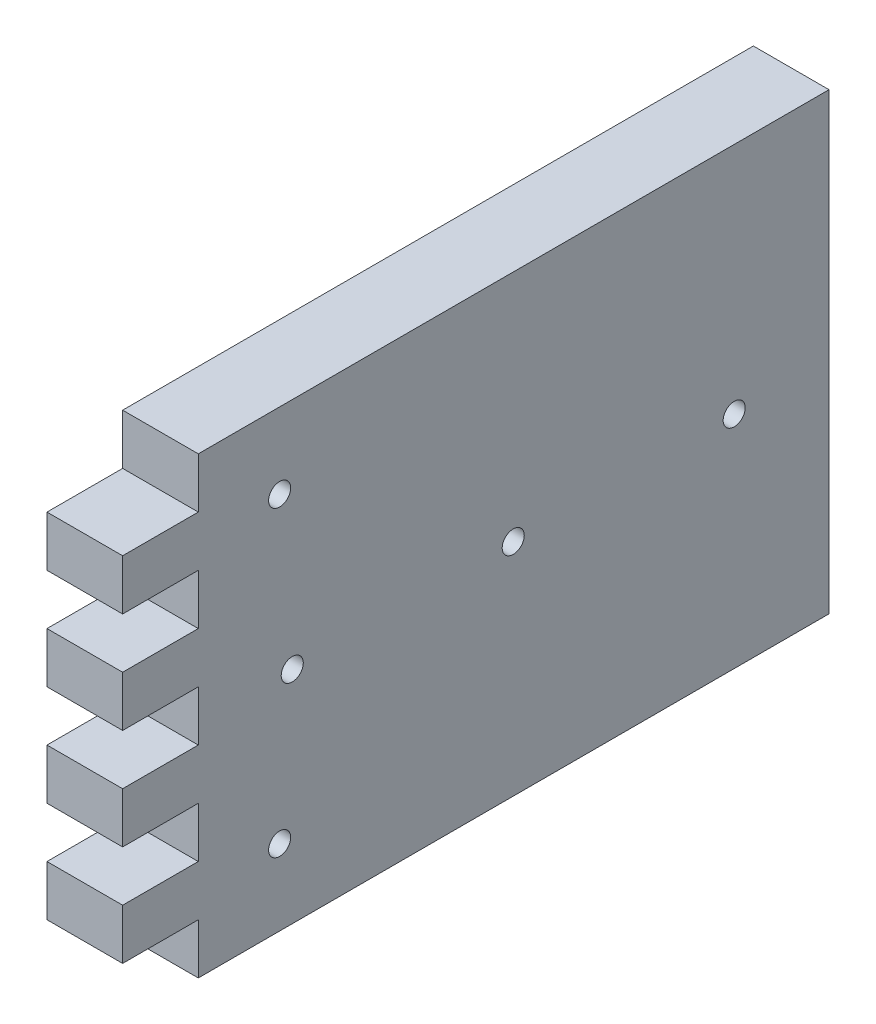
ISO-10303-21;
HEADER;
FILE_DESCRIPTION(('STEP AP214'),'2;1');
FILE_NAME('part.step','',(''),(''),'','','');
FILE_SCHEMA(('AUTOMOTIVE_DESIGN { 1 0 10303 214 1 1 1 1 }'));
ENDSEC;
DATA;
#1=APPLICATION_CONTEXT('core data for automotive mechanical design processes');
#2=APPLICATION_PROTOCOL_DEFINITION('international standard','automotive_design',2000,#1);
#3=PRODUCT_CONTEXT('',#1,'mechanical');
#4=PRODUCT('Part','Part','',(#3));
#5=PRODUCT_RELATED_PRODUCT_CATEGORY('part','',(#4));
#6=PRODUCT_DEFINITION_FORMATION('','',#4);
#7=PRODUCT_DEFINITION_CONTEXT('part definition',#1,'design');
#8=PRODUCT_DEFINITION('design','',#6,#7);
#9=PRODUCT_DEFINITION_SHAPE('','',#8);
#10=(LENGTH_UNIT() NAMED_UNIT(*) SI_UNIT(.MILLI.,.METRE.));
#11=(NAMED_UNIT(*) PLANE_ANGLE_UNIT() SI_UNIT($,.RADIAN.));
#12=(NAMED_UNIT(*) SI_UNIT($,.STERADIAN.) SOLID_ANGLE_UNIT());
#13=UNCERTAINTY_MEASURE_WITH_UNIT(LENGTH_MEASURE(1.E-05),#10,'distance_accuracy_value','');
#14=(GEOMETRIC_REPRESENTATION_CONTEXT(3) GLOBAL_UNCERTAINTY_ASSIGNED_CONTEXT((#13)) GLOBAL_UNIT_ASSIGNED_CONTEXT((#10,
#11,#12)) REPRESENTATION_CONTEXT('',''));
#15=CARTESIAN_POINT('',(0.,0.,0.));
#16=DIRECTION('',(0.,0.,1.));
#17=DIRECTION('',(1.,0.,0.));
#18=AXIS2_PLACEMENT_3D('',#15,#16,#17);
#19=CARTESIAN_POINT('',(19.05,114.3,-177.8635));
#20=DIRECTION('',(0.,0.,1.));
#21=DIRECTION('',(0.,-1.,0.));
#22=AXIS2_PLACEMENT_3D('',#19,#20,#21);
#23=PLANE('',#22);
#24=DIRECTION('',(0.,1.,0.));
#25=VECTOR('',#24,1.);
#26=CARTESIAN_POINT('',(0.,114.3,-177.8635));
#27=LINE('',#26,#25);
#28=CARTESIAN_POINT('',(0.,0.,-177.8635));
#29=VERTEX_POINT('',#28);
#30=CARTESIAN_POINT('',(0.,114.3,-177.8635));
#31=VERTEX_POINT('',#30);
#32=EDGE_CURVE('E202',#29,#31,#27,.T.);
#33=ORIENTED_EDGE('',*,*,#32,.T.);
#34=DIRECTION('',(-1.,0.,0.));
#35=VECTOR('',#34,1.);
#36=CARTESIAN_POINT('',(19.05,114.3,-177.8635));
#37=LINE('',#36,#35);
#38=CARTESIAN_POINT('',(19.05,114.3,-177.8635));
#39=VERTEX_POINT('',#38);
#40=EDGE_CURVE('E11',#39,#31,#37,.T.);
#41=ORIENTED_EDGE('',*,*,#40,.F.);
#42=DIRECTION('',(0.,1.,0.));
#43=VECTOR('',#42,1.);
#44=CARTESIAN_POINT('',(19.05,114.3,-177.8635));
#45=LINE('',#44,#43);
#46=CARTESIAN_POINT('',(19.05,0.,-177.8635));
#47=VERTEX_POINT('',#46);
#48=EDGE_CURVE('E241',#47,#39,#45,.T.);
#49=ORIENTED_EDGE('',*,*,#48,.F.);
#50=DIRECTION('',(-1.,0.,0.));
#51=VECTOR('',#50,1.);
#52=CARTESIAN_POINT('',(19.05,0.,-177.8635));
#53=LINE('',#52,#51);
#54=EDGE_CURVE('E198',#47,#29,#53,.T.);
#55=ORIENTED_EDGE('',*,*,#54,.T.);
#56=EDGE_LOOP('',(#33,#41,#49,#55));
#57=FACE_BOUND('',#56,.T.);
#58=ADVANCED_FACE('F34',(#57),#23,.F.);
#59=CARTESIAN_POINT('',(19.05,114.3,-19.05));
#60=DIRECTION('',(0.,-1.,0.));
#61=DIRECTION('',(0.,0.,-1.));
#62=AXIS2_PLACEMENT_3D('',#59,#60,#61);
#63=PLANE('',#62);
#64=DIRECTION('',(0.,0.,1.));
#65=VECTOR('',#64,1.);
#66=CARTESIAN_POINT('',(0.,114.3,-19.05));
#67=LINE('',#66,#65);
#68=CARTESIAN_POINT('',(0.,114.3,-19.05));
#69=VERTEX_POINT('',#68);
#70=EDGE_CURVE('E205',#31,#69,#67,.T.);
#71=ORIENTED_EDGE('',*,*,#70,.T.);
#72=DIRECTION('',(-1.,0.,0.));
#73=VECTOR('',#72,1.);
#74=CARTESIAN_POINT('',(19.05,114.3,-19.05));
#75=LINE('',#74,#73);
#76=CARTESIAN_POINT('',(19.05,114.3,-19.05));
#77=VERTEX_POINT('',#76);
#78=EDGE_CURVE('E42',#77,#69,#75,.T.);
#79=ORIENTED_EDGE('',*,*,#78,.F.);
#80=DIRECTION('',(0.,0.,1.));
#81=VECTOR('',#80,1.);
#82=CARTESIAN_POINT('',(19.05,114.3,-19.05));
#83=LINE('',#82,#81);
#84=EDGE_CURVE('E129',#39,#77,#83,.T.);
#85=ORIENTED_EDGE('',*,*,#84,.F.);
#86=ORIENTED_EDGE('',*,*,#40,.T.);
#87=EDGE_LOOP('',(#71,#79,#85,#86));
#88=FACE_BOUND('',#87,.T.);
#89=ADVANCED_FACE('F360',(#88),#63,.F.);
#90=CARTESIAN_POINT('',(19.05,114.3,-19.05));
#91=DIRECTION('',(0.,0.,-1.));
#92=DIRECTION('',(-1.,0.,0.));
#93=AXIS2_PLACEMENT_3D('',#90,#91,#92);
#94=PLANE('',#93);
#95=DIRECTION('',(0.,-1.,0.));
#96=VECTOR('',#95,1.);
#97=CARTESIAN_POINT('',(0.,114.3,-19.05));
#98=LINE('',#97,#96);
#99=CARTESIAN_POINT('',(0.,101.6,-19.05));
#100=VERTEX_POINT('',#99);
#101=EDGE_CURVE('E208',#69,#100,#98,.T.);
#102=ORIENTED_EDGE('',*,*,#101,.T.);
#103=DIRECTION('',(-1.,0.,0.));
#104=VECTOR('',#103,1.);
#105=CARTESIAN_POINT('',(19.05,101.6,-19.05));
#106=LINE('',#105,#104);
#107=CARTESIAN_POINT('',(19.05,101.6,-19.05));
#108=VERTEX_POINT('',#107);
#109=EDGE_CURVE('E284',#108,#100,#106,.T.);
#110=ORIENTED_EDGE('',*,*,#109,.F.);
#111=DIRECTION('',(0.,-1.,0.));
#112=VECTOR('',#111,1.);
#113=CARTESIAN_POINT('',(19.05,114.3,-19.05));
#114=LINE('',#113,#112);
#115=EDGE_CURVE('E292',#77,#108,#114,.T.);
#116=ORIENTED_EDGE('',*,*,#115,.F.);
#117=ORIENTED_EDGE('',*,*,#78,.T.);
#118=EDGE_LOOP('',(#102,#110,#116,#117));
#119=FACE_BOUND('',#118,.T.);
#120=ADVANCED_FACE('F290',(#119),#94,.F.);
#121=CARTESIAN_POINT('',(19.05,101.6,0.));
#122=DIRECTION('',(0.,-1.,0.));
#123=DIRECTION('',(0.,0.,-1.));
#124=AXIS2_PLACEMENT_3D('',#121,#122,#123);
#125=PLANE('',#124);
#126=DIRECTION('',(0.,0.,1.));
#127=VECTOR('',#126,1.);
#128=CARTESIAN_POINT('',(0.,101.6,0.));
#129=LINE('',#128,#127);
#130=CARTESIAN_POINT('',(0.,101.6,0.));
#131=VERTEX_POINT('',#130);
#132=EDGE_CURVE('E210',#100,#131,#129,.T.);
#133=ORIENTED_EDGE('',*,*,#132,.T.);
#134=DIRECTION('',(-1.,0.,0.));
#135=VECTOR('',#134,1.);
#136=CARTESIAN_POINT('',(19.05,101.6,0.));
#137=LINE('',#136,#135);
#138=CARTESIAN_POINT('',(19.05,101.6,0.));
#139=VERTEX_POINT('',#138);
#140=EDGE_CURVE('E281',#139,#131,#137,.T.);
#141=ORIENTED_EDGE('',*,*,#140,.F.);
#142=DIRECTION('',(0.,0.,1.));
#143=VECTOR('',#142,1.);
#144=CARTESIAN_POINT('',(19.05,101.6,0.));
#145=LINE('',#144,#143);
#146=EDGE_CURVE('E310',#108,#139,#145,.T.);
#147=ORIENTED_EDGE('',*,*,#146,.F.);
#148=ORIENTED_EDGE('',*,*,#109,.T.);
#149=EDGE_LOOP('',(#133,#141,#147,#148));
#150=FACE_BOUND('',#149,.T.);
#151=ADVANCED_FACE('F301',(#150),#125,.F.);
#152=CARTESIAN_POINT('',(19.05,88.9,0.));
#153=DIRECTION('',(0.,0.,-1.));
#154=DIRECTION('',(-1.,0.,0.));
#155=AXIS2_PLACEMENT_3D('',#152,#153,#154);
#156=PLANE('',#155);
#157=DIRECTION('',(0.,-1.,0.));
#158=VECTOR('',#157,1.);
#159=CARTESIAN_POINT('',(0.,88.9,0.));
#160=LINE('',#159,#158);
#161=CARTESIAN_POINT('',(0.,88.9,0.));
#162=VERTEX_POINT('',#161);
#163=EDGE_CURVE('E212',#131,#162,#160,.T.);
#164=ORIENTED_EDGE('',*,*,#163,.T.);
#165=DIRECTION('',(-1.,0.,0.));
#166=VECTOR('',#165,1.);
#167=CARTESIAN_POINT('',(19.05,88.9,0.));
#168=LINE('',#167,#166);
#169=CARTESIAN_POINT('',(19.05,88.9,0.));
#170=VERTEX_POINT('',#169);
#171=EDGE_CURVE('E278',#170,#162,#168,.T.);
#172=ORIENTED_EDGE('',*,*,#171,.F.);
#173=DIRECTION('',(0.,-1.,0.));
#174=VECTOR('',#173,1.);
#175=CARTESIAN_POINT('',(19.05,88.9,0.));
#176=LINE('',#175,#174);
#177=EDGE_CURVE('E307',#139,#170,#176,.T.);
#178=ORIENTED_EDGE('',*,*,#177,.F.);
#179=ORIENTED_EDGE('',*,*,#140,.T.);
#180=EDGE_LOOP('',(#164,#172,#178,#179));
#181=FACE_BOUND('',#180,.T.);
#182=ADVANCED_FACE('F305',(#181),#156,.F.);
#183=CARTESIAN_POINT('',(19.05,88.9,0.));
#184=DIRECTION('',(0.,1.,0.));
#185=DIRECTION('',(0.,0.,1.));
#186=AXIS2_PLACEMENT_3D('',#183,#184,#185);
#187=PLANE('',#186);
#188=DIRECTION('',(0.,0.,-1.));
#189=VECTOR('',#188,1.);
#190=CARTESIAN_POINT('',(0.,88.9,0.));
#191=LINE('',#190,#189);
#192=CARTESIAN_POINT('',(0.,88.9,-19.05));
#193=VERTEX_POINT('',#192);
#194=EDGE_CURVE('E214',#162,#193,#191,.T.);
#195=ORIENTED_EDGE('',*,*,#194,.T.);
#196=DIRECTION('',(-1.,0.,0.));
#197=VECTOR('',#196,1.);
#198=CARTESIAN_POINT('',(19.05,88.9,-19.05));
#199=LINE('',#198,#197);
#200=CARTESIAN_POINT('',(19.05,88.9,-19.05));
#201=VERTEX_POINT('',#200);
#202=EDGE_CURVE('E275',#201,#193,#199,.T.);
#203=ORIENTED_EDGE('',*,*,#202,.F.);
#204=DIRECTION('',(0.,0.,-1.));
#205=VECTOR('',#204,1.);
#206=CARTESIAN_POINT('',(19.05,88.9,0.));
#207=LINE('',#206,#205);
#208=EDGE_CURVE('E309',#170,#201,#207,.T.);
#209=ORIENTED_EDGE('',*,*,#208,.F.);
#210=ORIENTED_EDGE('',*,*,#171,.T.);
#211=EDGE_LOOP('',(#195,#203,#209,#210));
#212=FACE_BOUND('',#211,.T.);
#213=ADVANCED_FACE('F373',(#212),#187,.F.);
#214=CARTESIAN_POINT('',(19.05,88.9,-19.05));
#215=DIRECTION('',(0.,0.,-1.));
#216=DIRECTION('',(-1.,0.,0.));
#217=AXIS2_PLACEMENT_3D('',#214,#215,#216);
#218=PLANE('',#217);
#219=DIRECTION('',(0.,-1.,0.));
#220=VECTOR('',#219,1.);
#221=CARTESIAN_POINT('',(0.,88.9,-19.05));
#222=LINE('',#221,#220);
#223=CARTESIAN_POINT('',(0.,76.2,-19.05));
#224=VERTEX_POINT('',#223);
#225=EDGE_CURVE('E216',#193,#224,#222,.T.);
#226=ORIENTED_EDGE('',*,*,#225,.T.);
#227=DIRECTION('',(-1.,0.,0.));
#228=VECTOR('',#227,1.);
#229=CARTESIAN_POINT('',(19.05,76.2,-19.05));
#230=LINE('',#229,#228);
#231=CARTESIAN_POINT('',(19.05,76.2,-19.05));
#232=VERTEX_POINT('',#231);
#233=EDGE_CURVE('E272',#232,#224,#230,.T.);
#234=ORIENTED_EDGE('',*,*,#233,.F.);
#235=DIRECTION('',(0.,-1.,0.));
#236=VECTOR('',#235,1.);
#237=CARTESIAN_POINT('',(19.05,88.9,-19.05));
#238=LINE('',#237,#236);
#239=EDGE_CURVE('E312',#201,#232,#238,.T.);
#240=ORIENTED_EDGE('',*,*,#239,.F.);
#241=ORIENTED_EDGE('',*,*,#202,.T.);
#242=EDGE_LOOP('',(#226,#234,#240,#241));
#243=FACE_BOUND('',#242,.T.);
#244=ADVANCED_FACE('F376',(#243),#218,.F.);
#245=CARTESIAN_POINT('',(19.05,76.2,0.));
#246=DIRECTION('',(0.,-1.,0.));
#247=DIRECTION('',(0.,0.,-1.));
#248=AXIS2_PLACEMENT_3D('',#245,#246,#247);
#249=PLANE('',#248);
#250=DIRECTION('',(0.,0.,1.));
#251=VECTOR('',#250,1.);
#252=CARTESIAN_POINT('',(0.,76.2,0.));
#253=LINE('',#252,#251);
#254=CARTESIAN_POINT('',(0.,76.2,0.));
#255=VERTEX_POINT('',#254);
#256=EDGE_CURVE('E218',#224,#255,#253,.T.);
#257=ORIENTED_EDGE('',*,*,#256,.T.);
#258=DIRECTION('',(-1.,0.,0.));
#259=VECTOR('',#258,1.);
#260=CARTESIAN_POINT('',(19.05,76.2,0.));
#261=LINE('',#260,#259);
#262=CARTESIAN_POINT('',(19.05,76.2,0.));
#263=VERTEX_POINT('',#262);
#264=EDGE_CURVE('E269',#263,#255,#261,.T.);
#265=ORIENTED_EDGE('',*,*,#264,.F.);
#266=DIRECTION('',(0.,0.,1.));
#267=VECTOR('',#266,1.);
#268=CARTESIAN_POINT('',(19.05,76.2,0.));
#269=LINE('',#268,#267);
#270=EDGE_CURVE('E318',#232,#263,#269,.T.);
#271=ORIENTED_EDGE('',*,*,#270,.F.);
#272=ORIENTED_EDGE('',*,*,#233,.T.);
#273=EDGE_LOOP('',(#257,#265,#271,#272));
#274=FACE_BOUND('',#273,.T.);
#275=ADVANCED_FACE('F380',(#274),#249,.F.);
#276=CARTESIAN_POINT('',(19.05,63.5,0.));
#277=DIRECTION('',(0.,0.,-1.));
#278=DIRECTION('',(-1.,0.,0.));
#279=AXIS2_PLACEMENT_3D('',#276,#277,#278);
#280=PLANE('',#279);
#281=DIRECTION('',(0.,-1.,0.));
#282=VECTOR('',#281,1.);
#283=CARTESIAN_POINT('',(0.,63.5,0.));
#284=LINE('',#283,#282);
#285=CARTESIAN_POINT('',(0.,63.5,0.));
#286=VERTEX_POINT('',#285);
#287=EDGE_CURVE('E220',#255,#286,#284,.T.);
#288=ORIENTED_EDGE('',*,*,#287,.T.);
#289=DIRECTION('',(-1.,0.,0.));
#290=VECTOR('',#289,1.);
#291=CARTESIAN_POINT('',(19.05,63.5,0.));
#292=LINE('',#291,#290);
#293=CARTESIAN_POINT('',(19.05,63.5,0.));
#294=VERTEX_POINT('',#293);
#295=EDGE_CURVE('E266',#294,#286,#292,.T.);
#296=ORIENTED_EDGE('',*,*,#295,.F.);
#297=DIRECTION('',(0.,-1.,0.));
#298=VECTOR('',#297,1.);
#299=CARTESIAN_POINT('',(19.05,63.5,0.));
#300=LINE('',#299,#298);
#301=EDGE_CURVE('E320',#263,#294,#300,.T.);
#302=ORIENTED_EDGE('',*,*,#301,.F.);
#303=ORIENTED_EDGE('',*,*,#264,.T.);
#304=EDGE_LOOP('',(#288,#296,#302,#303));
#305=FACE_BOUND('',#304,.T.);
#306=ADVANCED_FACE('F384',(#305),#280,.F.);
#307=CARTESIAN_POINT('',(19.05,63.5,0.));
#308=DIRECTION('',(0.,1.,0.));
#309=DIRECTION('',(0.,0.,1.));
#310=AXIS2_PLACEMENT_3D('',#307,#308,#309);
#311=PLANE('',#310);
#312=DIRECTION('',(0.,0.,-1.));
#313=VECTOR('',#312,1.);
#314=CARTESIAN_POINT('',(0.,63.5,0.));
#315=LINE('',#314,#313);
#316=CARTESIAN_POINT('',(0.,63.5,-19.05));
#317=VERTEX_POINT('',#316);
#318=EDGE_CURVE('E222',#286,#317,#315,.T.);
#319=ORIENTED_EDGE('',*,*,#318,.T.);
#320=DIRECTION('',(-1.,0.,0.));
#321=VECTOR('',#320,1.);
#322=CARTESIAN_POINT('',(19.05,63.5,-19.05));
#323=LINE('',#322,#321);
#324=CARTESIAN_POINT('',(19.05,63.5,-19.05));
#325=VERTEX_POINT('',#324);
#326=EDGE_CURVE('E263',#325,#317,#323,.T.);
#327=ORIENTED_EDGE('',*,*,#326,.F.);
#328=DIRECTION('',(0.,0.,-1.));
#329=VECTOR('',#328,1.);
#330=CARTESIAN_POINT('',(19.05,63.5,0.));
#331=LINE('',#330,#329);
#332=EDGE_CURVE('E322',#294,#325,#331,.T.);
#333=ORIENTED_EDGE('',*,*,#332,.F.);
#334=ORIENTED_EDGE('',*,*,#295,.T.);
#335=EDGE_LOOP('',(#319,#327,#333,#334));
#336=FACE_BOUND('',#335,.T.);
#337=ADVANCED_FACE('F388',(#336),#311,.F.);
#338=CARTESIAN_POINT('',(19.05,63.5,-19.05));
#339=DIRECTION('',(0.,0.,-1.));
#340=DIRECTION('',(-1.,0.,0.));
#341=AXIS2_PLACEMENT_3D('',#338,#339,#340);
#342=PLANE('',#341);
#343=DIRECTION('',(0.,-1.,0.));
#344=VECTOR('',#343,1.);
#345=CARTESIAN_POINT('',(0.,63.5,-19.05));
#346=LINE('',#345,#344);
#347=CARTESIAN_POINT('',(0.,50.8,-19.05));
#348=VERTEX_POINT('',#347);
#349=EDGE_CURVE('E224',#317,#348,#346,.T.);
#350=ORIENTED_EDGE('',*,*,#349,.T.);
#351=DIRECTION('',(-1.,0.,0.));
#352=VECTOR('',#351,1.);
#353=CARTESIAN_POINT('',(19.05,50.8,-19.05));
#354=LINE('',#353,#352);
#355=CARTESIAN_POINT('',(19.05,50.8,-19.05));
#356=VERTEX_POINT('',#355);
#357=EDGE_CURVE('E260',#356,#348,#354,.T.);
#358=ORIENTED_EDGE('',*,*,#357,.F.);
#359=DIRECTION('',(0.,-1.,0.));
#360=VECTOR('',#359,1.);
#361=CARTESIAN_POINT('',(19.05,63.5,-19.05));
#362=LINE('',#361,#360);
#363=EDGE_CURVE('E324',#325,#356,#362,.T.);
#364=ORIENTED_EDGE('',*,*,#363,.F.);
#365=ORIENTED_EDGE('',*,*,#326,.T.);
#366=EDGE_LOOP('',(#350,#358,#364,#365));
#367=FACE_BOUND('',#366,.T.);
#368=ADVANCED_FACE('F392',(#367),#342,.F.);
#369=CARTESIAN_POINT('',(19.05,50.8,0.));
#370=DIRECTION('',(0.,-1.,0.));
#371=DIRECTION('',(0.,0.,-1.));
#372=AXIS2_PLACEMENT_3D('',#369,#370,#371);
#373=PLANE('',#372);
#374=DIRECTION('',(0.,0.,1.));
#375=VECTOR('',#374,1.);
#376=CARTESIAN_POINT('',(0.,50.8,0.));
#377=LINE('',#376,#375);
#378=CARTESIAN_POINT('',(0.,50.8,0.));
#379=VERTEX_POINT('',#378);
#380=EDGE_CURVE('E226',#348,#379,#377,.T.);
#381=ORIENTED_EDGE('',*,*,#380,.T.);
#382=DIRECTION('',(-1.,0.,0.));
#383=VECTOR('',#382,1.);
#384=CARTESIAN_POINT('',(19.05,50.8,0.));
#385=LINE('',#384,#383);
#386=CARTESIAN_POINT('',(19.05,50.8,0.));
#387=VERTEX_POINT('',#386);
#388=EDGE_CURVE('E257',#387,#379,#385,.T.);
#389=ORIENTED_EDGE('',*,*,#388,.F.);
#390=DIRECTION('',(0.,0.,1.));
#391=VECTOR('',#390,1.);
#392=CARTESIAN_POINT('',(19.05,50.8,0.));
#393=LINE('',#392,#391);
#394=EDGE_CURVE('E326',#356,#387,#393,.T.);
#395=ORIENTED_EDGE('',*,*,#394,.F.);
#396=ORIENTED_EDGE('',*,*,#357,.T.);
#397=EDGE_LOOP('',(#381,#389,#395,#396));
#398=FACE_BOUND('',#397,.T.);
#399=ADVANCED_FACE('F396',(#398),#373,.F.);
#400=CARTESIAN_POINT('',(19.05,38.1,0.));
#401=DIRECTION('',(0.,0.,-1.));
#402=DIRECTION('',(-1.,0.,0.));
#403=AXIS2_PLACEMENT_3D('',#400,#401,#402);
#404=PLANE('',#403);
#405=DIRECTION('',(0.,-1.,0.));
#406=VECTOR('',#405,1.);
#407=CARTESIAN_POINT('',(0.,38.1,0.));
#408=LINE('',#407,#406);
#409=CARTESIAN_POINT('',(0.,38.1,0.));
#410=VERTEX_POINT('',#409);
#411=EDGE_CURVE('E228',#379,#410,#408,.T.);
#412=ORIENTED_EDGE('',*,*,#411,.T.);
#413=DIRECTION('',(-1.,0.,0.));
#414=VECTOR('',#413,1.);
#415=CARTESIAN_POINT('',(19.05,38.1,0.));
#416=LINE('',#415,#414);
#417=CARTESIAN_POINT('',(19.05,38.1,0.));
#418=VERTEX_POINT('',#417);
#419=EDGE_CURVE('E254',#418,#410,#416,.T.);
#420=ORIENTED_EDGE('',*,*,#419,.F.);
#421=DIRECTION('',(0.,-1.,0.));
#422=VECTOR('',#421,1.);
#423=CARTESIAN_POINT('',(19.05,38.1,0.));
#424=LINE('',#423,#422);
#425=EDGE_CURVE('E328',#387,#418,#424,.T.);
#426=ORIENTED_EDGE('',*,*,#425,.F.);
#427=ORIENTED_EDGE('',*,*,#388,.T.);
#428=EDGE_LOOP('',(#412,#420,#426,#427));
#429=FACE_BOUND('',#428,.T.);
#430=ADVANCED_FACE('F400',(#429),#404,.F.);
#431=CARTESIAN_POINT('',(19.05,38.1,0.));
#432=DIRECTION('',(0.,1.,0.));
#433=DIRECTION('',(0.,0.,1.));
#434=AXIS2_PLACEMENT_3D('',#431,#432,#433);
#435=PLANE('',#434);
#436=DIRECTION('',(0.,0.,-1.));
#437=VECTOR('',#436,1.);
#438=CARTESIAN_POINT('',(0.,38.1,0.));
#439=LINE('',#438,#437);
#440=CARTESIAN_POINT('',(0.,38.1,-19.05));
#441=VERTEX_POINT('',#440);
#442=EDGE_CURVE('E230',#410,#441,#439,.T.);
#443=ORIENTED_EDGE('',*,*,#442,.T.);
#444=DIRECTION('',(-1.,0.,0.));
#445=VECTOR('',#444,1.);
#446=CARTESIAN_POINT('',(19.05,38.1,-19.05));
#447=LINE('',#446,#445);
#448=CARTESIAN_POINT('',(19.05,38.1,-19.05));
#449=VERTEX_POINT('',#448);
#450=EDGE_CURVE('E251',#449,#441,#447,.T.);
#451=ORIENTED_EDGE('',*,*,#450,.F.);
#452=DIRECTION('',(0.,0.,-1.));
#453=VECTOR('',#452,1.);
#454=CARTESIAN_POINT('',(19.05,38.1,0.));
#455=LINE('',#454,#453);
#456=EDGE_CURVE('E330',#418,#449,#455,.T.);
#457=ORIENTED_EDGE('',*,*,#456,.F.);
#458=ORIENTED_EDGE('',*,*,#419,.T.);
#459=EDGE_LOOP('',(#443,#451,#457,#458));
#460=FACE_BOUND('',#459,.T.);
#461=ADVANCED_FACE('F404',(#460),#435,.F.);
#462=CARTESIAN_POINT('',(19.05,38.1,-19.05));
#463=DIRECTION('',(0.,0.,-1.));
#464=DIRECTION('',(-1.,0.,0.));
#465=AXIS2_PLACEMENT_3D('',#462,#463,#464);
#466=PLANE('',#465);
#467=DIRECTION('',(0.,-1.,0.));
#468=VECTOR('',#467,1.);
#469=CARTESIAN_POINT('',(0.,38.1,-19.05));
#470=LINE('',#469,#468);
#471=CARTESIAN_POINT('',(0.,25.4,-19.05));
#472=VERTEX_POINT('',#471);
#473=EDGE_CURVE('E232',#441,#472,#470,.T.);
#474=ORIENTED_EDGE('',*,*,#473,.T.);
#475=DIRECTION('',(-1.,0.,0.));
#476=VECTOR('',#475,1.);
#477=CARTESIAN_POINT('',(19.05,25.4,-19.05));
#478=LINE('',#477,#476);
#479=CARTESIAN_POINT('',(19.05,25.4,-19.05));
#480=VERTEX_POINT('',#479);
#481=EDGE_CURVE('E248',#480,#472,#478,.T.);
#482=ORIENTED_EDGE('',*,*,#481,.F.);
#483=DIRECTION('',(0.,-1.,0.));
#484=VECTOR('',#483,1.);
#485=CARTESIAN_POINT('',(19.05,38.1,-19.05));
#486=LINE('',#485,#484);
#487=EDGE_CURVE('E332',#449,#480,#486,.T.);
#488=ORIENTED_EDGE('',*,*,#487,.F.);
#489=ORIENTED_EDGE('',*,*,#450,.T.);
#490=EDGE_LOOP('',(#474,#482,#488,#489));
#491=FACE_BOUND('',#490,.T.);
#492=ADVANCED_FACE('F408',(#491),#466,.F.);
#493=CARTESIAN_POINT('',(19.05,25.4,0.));
#494=DIRECTION('',(0.,-1.,0.));
#495=DIRECTION('',(0.,0.,-1.));
#496=AXIS2_PLACEMENT_3D('',#493,#494,#495);
#497=PLANE('',#496);
#498=DIRECTION('',(0.,0.,1.));
#499=VECTOR('',#498,1.);
#500=CARTESIAN_POINT('',(0.,25.4,0.));
#501=LINE('',#500,#499);
#502=CARTESIAN_POINT('',(0.,25.4,0.));
#503=VERTEX_POINT('',#502);
#504=EDGE_CURVE('E234',#472,#503,#501,.T.);
#505=ORIENTED_EDGE('',*,*,#504,.T.);
#506=DIRECTION('',(-1.,0.,0.));
#507=VECTOR('',#506,1.);
#508=CARTESIAN_POINT('',(19.05,25.4,0.));
#509=LINE('',#508,#507);
#510=CARTESIAN_POINT('',(19.05,25.4,0.));
#511=VERTEX_POINT('',#510);
#512=EDGE_CURVE('E245',#511,#503,#509,.T.);
#513=ORIENTED_EDGE('',*,*,#512,.F.);
#514=DIRECTION('',(0.,0.,1.));
#515=VECTOR('',#514,1.);
#516=CARTESIAN_POINT('',(19.05,25.4,0.));
#517=LINE('',#516,#515);
#518=EDGE_CURVE('E334',#480,#511,#517,.T.);
#519=ORIENTED_EDGE('',*,*,#518,.F.);
#520=ORIENTED_EDGE('',*,*,#481,.T.);
#521=EDGE_LOOP('',(#505,#513,#519,#520));
#522=FACE_BOUND('',#521,.T.);
#523=ADVANCED_FACE('F340',(#522),#497,.F.);
#524=CARTESIAN_POINT('',(19.05,12.7,0.));
#525=DIRECTION('',(0.,0.,-1.));
#526=DIRECTION('',(-1.,0.,0.));
#527=AXIS2_PLACEMENT_3D('',#524,#525,#526);
#528=PLANE('',#527);
#529=DIRECTION('',(0.,-1.,0.));
#530=VECTOR('',#529,1.);
#531=CARTESIAN_POINT('',(0.,12.7,0.));
#532=LINE('',#531,#530);
#533=CARTESIAN_POINT('',(0.,12.7,0.));
#534=VERTEX_POINT('',#533);
#535=EDGE_CURVE('E236',#503,#534,#532,.T.);
#536=ORIENTED_EDGE('',*,*,#535,.T.);
#537=DIRECTION('',(-1.,0.,0.));
#538=VECTOR('',#537,1.);
#539=CARTESIAN_POINT('',(19.05,12.7,0.));
#540=LINE('',#539,#538);
#541=CARTESIAN_POINT('',(19.05,12.7,0.));
#542=VERTEX_POINT('',#541);
#543=EDGE_CURVE('E193',#542,#534,#540,.T.);
#544=ORIENTED_EDGE('',*,*,#543,.F.);
#545=DIRECTION('',(0.,-1.,0.));
#546=VECTOR('',#545,1.);
#547=CARTESIAN_POINT('',(19.05,12.7,0.));
#548=LINE('',#547,#546);
#549=EDGE_CURVE('E184',#511,#542,#548,.T.);
#550=ORIENTED_EDGE('',*,*,#549,.F.);
#551=ORIENTED_EDGE('',*,*,#512,.T.);
#552=EDGE_LOOP('',(#536,#544,#550,#551));
#553=FACE_BOUND('',#552,.T.);
#554=ADVANCED_FACE('F344',(#553),#528,.F.);
#555=CARTESIAN_POINT('',(19.05,12.7,0.));
#556=DIRECTION('',(0.,1.,0.));
#557=DIRECTION('',(0.,0.,1.));
#558=AXIS2_PLACEMENT_3D('',#555,#556,#557);
#559=PLANE('',#558);
#560=DIRECTION('',(0.,0.,-1.));
#561=VECTOR('',#560,1.);
#562=CARTESIAN_POINT('',(0.,12.7,0.));
#563=LINE('',#562,#561);
#564=CARTESIAN_POINT('',(0.,12.7,-19.05));
#565=VERTEX_POINT('',#564);
#566=EDGE_CURVE('E192',#534,#565,#563,.T.);
#567=ORIENTED_EDGE('',*,*,#566,.T.);
#568=DIRECTION('',(-1.,0.,0.));
#569=VECTOR('',#568,1.);
#570=CARTESIAN_POINT('',(19.05,12.7,-19.05));
#571=LINE('',#570,#569);
#572=CARTESIAN_POINT('',(19.05,12.7,-19.05));
#573=VERTEX_POINT('',#572);
#574=EDGE_CURVE('E189',#573,#565,#571,.T.);
#575=ORIENTED_EDGE('',*,*,#574,.F.);
#576=DIRECTION('',(0.,0.,-1.));
#577=VECTOR('',#576,1.);
#578=CARTESIAN_POINT('',(19.05,12.7,0.));
#579=LINE('',#578,#577);
#580=EDGE_CURVE('E178',#542,#573,#579,.T.);
#581=ORIENTED_EDGE('',*,*,#580,.F.);
#582=ORIENTED_EDGE('',*,*,#543,.T.);
#583=EDGE_LOOP('',(#567,#575,#581,#582));
#584=FACE_BOUND('',#583,.T.);
#585=ADVANCED_FACE('F190',(#584),#559,.F.);
#586=CARTESIAN_POINT('',(19.05,0.,-19.05));
#587=DIRECTION('',(0.,0.,-1.));
#588=DIRECTION('',(0.,1.,0.));
#589=AXIS2_PLACEMENT_3D('',#586,#587,#588);
#590=PLANE('',#589);
#591=DIRECTION('',(0.,-1.,0.));
#592=VECTOR('',#591,1.);
#593=CARTESIAN_POINT('',(0.,0.,-19.05));
#594=LINE('',#593,#592);
#595=CARTESIAN_POINT('',(0.,0.,-19.05));
#596=VERTEX_POINT('',#595);
#597=EDGE_CURVE('E115',#565,#596,#594,.T.);
#598=ORIENTED_EDGE('',*,*,#597,.T.);
#599=DIRECTION('',(-1.,0.,0.));
#600=VECTOR('',#599,1.);
#601=CARTESIAN_POINT('',(19.05,0.,-19.05));
#602=LINE('',#601,#600);
#603=CARTESIAN_POINT('',(19.05,0.,-19.05));
#604=VERTEX_POINT('',#603);
#605=EDGE_CURVE('E194',#604,#596,#602,.T.);
#606=ORIENTED_EDGE('',*,*,#605,.F.);
#607=DIRECTION('',(0.,-1.,0.));
#608=VECTOR('',#607,1.);
#609=CARTESIAN_POINT('',(19.05,0.,-19.05));
#610=LINE('',#609,#608);
#611=EDGE_CURVE('E182',#573,#604,#610,.T.);
#612=ORIENTED_EDGE('',*,*,#611,.F.);
#613=ORIENTED_EDGE('',*,*,#574,.T.);
#614=EDGE_LOOP('',(#598,#606,#612,#613));
#615=FACE_BOUND('',#614,.T.);
#616=ADVANCED_FACE('F196',(#615),#590,.F.);
#617=CARTESIAN_POINT('',(19.05,0.,-19.05));
#618=DIRECTION('',(0.,1.,0.));
#619=DIRECTION('',(0.,0.,1.));
#620=AXIS2_PLACEMENT_3D('',#617,#618,#619);
#621=PLANE('',#620);
#622=DIRECTION('',(0.,0.,-1.));
#623=VECTOR('',#622,1.);
#624=CARTESIAN_POINT('',(0.,0.,-19.05));
#625=LINE('',#624,#623);
#626=EDGE_CURVE('E121',#596,#29,#625,.T.);
#627=ORIENTED_EDGE('',*,*,#626,.T.);
#628=ORIENTED_EDGE('',*,*,#54,.F.);
#629=DIRECTION('',(0.,0.,-1.));
#630=VECTOR('',#629,1.);
#631=CARTESIAN_POINT('',(19.05,0.,-19.05));
#632=LINE('',#631,#630);
#633=EDGE_CURVE('E50',#604,#47,#632,.T.);
#634=ORIENTED_EDGE('',*,*,#633,.F.);
#635=ORIENTED_EDGE('',*,*,#605,.T.);
#636=EDGE_LOOP('',(#627,#628,#634,#635));
#637=FACE_BOUND('',#636,.T.);
#638=ADVANCED_FACE('F348',(#637),#621,.F.);
#639=CARTESIAN_POINT('',(19.05,0.,0.));
#640=DIRECTION('',(1.,0.,0.));
#641=DIRECTION('',(0.,0.,-1.));
#642=AXIS2_PLACEMENT_3D('',#639,#640,#641);
#643=PLANE('',#642);
#644=CARTESIAN_POINT('',(19.05,55.499,-153.9875));
#645=DIRECTION('',(1.,0.,0.));
#646=DIRECTION('',(0.,0.,-1.));
#647=AXIS2_PLACEMENT_3D('',#644,#645,#646);
#648=CIRCLE('',#647,2.778125);
#649=CARTESIAN_POINT('',(19.05,55.499,-156.765625));
#650=VERTEX_POINT('',#649);
#651=EDGE_CURVE('E504',#650,#650,#648,.T.);
#652=ORIENTED_EDGE('',*,*,#651,.F.);
#653=EDGE_LOOP('',(#652));
#654=FACE_BOUND('',#653,.T.);
#655=CARTESIAN_POINT('',(19.05,55.499,-98.3488));
#656=DIRECTION('',(1.,0.,0.));
#657=DIRECTION('',(0.,0.,-1.));
#658=AXIS2_PLACEMENT_3D('',#655,#656,#657);
#659=CIRCLE('',#658,2.778125);
#660=CARTESIAN_POINT('',(19.05,55.499,-101.126925));
#661=VERTEX_POINT('',#660);
#662=EDGE_CURVE('E506',#661,#661,#659,.T.);
#663=ORIENTED_EDGE('',*,*,#662,.F.);
#664=EDGE_LOOP('',(#663));
#665=FACE_BOUND('',#664,.T.);
#666=CARTESIAN_POINT('',(19.05,55.499,-42.7101));
#667=DIRECTION('',(1.,0.,0.));
#668=DIRECTION('',(0.,0.,-1.));
#669=AXIS2_PLACEMENT_3D('',#666,#667,#668);
#670=CIRCLE('',#669,2.778125);
#671=CARTESIAN_POINT('',(19.05,55.499,-45.488225));
#672=VERTEX_POINT('',#671);
#673=EDGE_CURVE('E514',#672,#672,#670,.T.);
#674=ORIENTED_EDGE('',*,*,#673,.F.);
#675=EDGE_LOOP('',(#674));
#676=FACE_BOUND('',#675,.T.);
#677=CARTESIAN_POINT('',(19.05,95.25,-39.5351));
#678=DIRECTION('',(1.,0.,0.));
#679=DIRECTION('',(0.,0.,-1.));
#680=AXIS2_PLACEMENT_3D('',#677,#678,#679);
#681=CIRCLE('',#680,2.77812499999999);
#682=CARTESIAN_POINT('',(19.05,95.25,-42.313225));
#683=VERTEX_POINT('',#682);
#684=EDGE_CURVE('E520',#683,#683,#681,.T.);
#685=ORIENTED_EDGE('',*,*,#684,.F.);
#686=EDGE_LOOP('',(#685));
#687=FACE_BOUND('',#686,.T.);
#688=CARTESIAN_POINT('',(19.05,19.05,-39.5351));
#689=DIRECTION('',(1.,0.,0.));
#690=DIRECTION('',(0.,0.,-1.));
#691=AXIS2_PLACEMENT_3D('',#688,#689,#690);
#692=CIRCLE('',#691,2.778125);
#693=CARTESIAN_POINT('',(19.05,19.05,-42.313225));
#694=VERTEX_POINT('',#693);
#695=EDGE_CURVE('E526',#694,#694,#692,.T.);
#696=ORIENTED_EDGE('',*,*,#695,.F.);
#697=EDGE_LOOP('',(#696));
#698=FACE_BOUND('',#697,.T.);
#699=ORIENTED_EDGE('',*,*,#48,.T.);
#700=ORIENTED_EDGE('',*,*,#84,.T.);
#701=ORIENTED_EDGE('',*,*,#115,.T.);
#702=ORIENTED_EDGE('',*,*,#146,.T.);
#703=ORIENTED_EDGE('',*,*,#177,.T.);
#704=ORIENTED_EDGE('',*,*,#208,.T.);
#705=ORIENTED_EDGE('',*,*,#239,.T.);
#706=ORIENTED_EDGE('',*,*,#270,.T.);
#707=ORIENTED_EDGE('',*,*,#301,.T.);
#708=ORIENTED_EDGE('',*,*,#332,.T.);
#709=ORIENTED_EDGE('',*,*,#363,.T.);
#710=ORIENTED_EDGE('',*,*,#394,.T.);
#711=ORIENTED_EDGE('',*,*,#425,.T.);
#712=ORIENTED_EDGE('',*,*,#456,.T.);
#713=ORIENTED_EDGE('',*,*,#487,.T.);
#714=ORIENTED_EDGE('',*,*,#518,.T.);
#715=ORIENTED_EDGE('',*,*,#549,.T.);
#716=ORIENTED_EDGE('',*,*,#580,.T.);
#717=ORIENTED_EDGE('',*,*,#611,.T.);
#718=ORIENTED_EDGE('',*,*,#633,.T.);
#719=EDGE_LOOP('',(#699,#700,#701,#702,#703,#704,#705,#706,#707,#708,#709,#710,#711,#712,#713,
#714,#715,#716,#717,#718));
#720=FACE_BOUND('',#719,.T.);
#721=ADVANCED_FACE('F180',(#654,#665,#676,#687,#698,#720),#643,.T.);
#722=CARTESIAN_POINT('',(0.,0.,0.));
#723=DIRECTION('',(1.,0.,0.));
#724=DIRECTION('',(0.,0.,-1.));
#725=AXIS2_PLACEMENT_3D('',#722,#723,#724);
#726=PLANE('',#725);
#727=CARTESIAN_POINT('',(0.,55.499,-153.9875));
#728=DIRECTION('',(1.,0.,0.));
#729=DIRECTION('',(0.,0.,-1.));
#730=AXIS2_PLACEMENT_3D('',#727,#728,#729);
#731=CIRCLE('',#730,2.778125);
#732=CARTESIAN_POINT('',(0.,55.499,-156.765625));
#733=VERTEX_POINT('',#732);
#734=EDGE_CURVE('E501',#733,#733,#731,.T.);
#735=ORIENTED_EDGE('',*,*,#734,.T.);
#736=EDGE_LOOP('',(#735));
#737=FACE_BOUND('',#736,.T.);
#738=CARTESIAN_POINT('',(0.,55.499,-98.3488));
#739=DIRECTION('',(1.,0.,0.));
#740=DIRECTION('',(0.,0.,-1.));
#741=AXIS2_PLACEMENT_3D('',#738,#739,#740);
#742=CIRCLE('',#741,2.778125);
#743=CARTESIAN_POINT('',(0.,55.499,-101.126925));
#744=VERTEX_POINT('',#743);
#745=EDGE_CURVE('E511',#744,#744,#742,.T.);
#746=ORIENTED_EDGE('',*,*,#745,.T.);
#747=EDGE_LOOP('',(#746));
#748=FACE_BOUND('',#747,.T.);
#749=CARTESIAN_POINT('',(0.,55.499,-42.7101));
#750=DIRECTION('',(1.,0.,0.));
#751=DIRECTION('',(0.,0.,-1.));
#752=AXIS2_PLACEMENT_3D('',#749,#750,#751);
#753=CIRCLE('',#752,2.778125);
#754=CARTESIAN_POINT('',(0.,55.499,-45.488225));
#755=VERTEX_POINT('',#754);
#756=EDGE_CURVE('E517',#755,#755,#753,.T.);
#757=ORIENTED_EDGE('',*,*,#756,.T.);
#758=EDGE_LOOP('',(#757));
#759=FACE_BOUND('',#758,.T.);
#760=CARTESIAN_POINT('',(0.,95.25,-39.5351));
#761=DIRECTION('',(1.,0.,0.));
#762=DIRECTION('',(0.,0.,-1.));
#763=AXIS2_PLACEMENT_3D('',#760,#761,#762);
#764=CIRCLE('',#763,2.77812499999999);
#765=CARTESIAN_POINT('',(0.,95.25,-42.313225));
#766=VERTEX_POINT('',#765);
#767=EDGE_CURVE('E523',#766,#766,#764,.T.);
#768=ORIENTED_EDGE('',*,*,#767,.T.);
#769=EDGE_LOOP('',(#768));
#770=FACE_BOUND('',#769,.T.);
#771=CARTESIAN_POINT('',(0.,19.05,-39.5351));
#772=DIRECTION('',(1.,0.,0.));
#773=DIRECTION('',(0.,0.,-1.));
#774=AXIS2_PLACEMENT_3D('',#771,#772,#773);
#775=CIRCLE('',#774,2.778125);
#776=CARTESIAN_POINT('',(0.,19.05,-42.313225));
#777=VERTEX_POINT('',#776);
#778=EDGE_CURVE('E206',#777,#777,#775,.T.);
#779=ORIENTED_EDGE('',*,*,#778,.T.);
#780=EDGE_LOOP('',(#779));
#781=FACE_BOUND('',#780,.T.);
#782=ORIENTED_EDGE('',*,*,#32,.F.);
#783=ORIENTED_EDGE('',*,*,#626,.F.);
#784=ORIENTED_EDGE('',*,*,#597,.F.);
#785=ORIENTED_EDGE('',*,*,#566,.F.);
#786=ORIENTED_EDGE('',*,*,#535,.F.);
#787=ORIENTED_EDGE('',*,*,#504,.F.);
#788=ORIENTED_EDGE('',*,*,#473,.F.);
#789=ORIENTED_EDGE('',*,*,#442,.F.);
#790=ORIENTED_EDGE('',*,*,#411,.F.);
#791=ORIENTED_EDGE('',*,*,#380,.F.);
#792=ORIENTED_EDGE('',*,*,#349,.F.);
#793=ORIENTED_EDGE('',*,*,#318,.F.);
#794=ORIENTED_EDGE('',*,*,#287,.F.);
#795=ORIENTED_EDGE('',*,*,#256,.F.);
#796=ORIENTED_EDGE('',*,*,#225,.F.);
#797=ORIENTED_EDGE('',*,*,#194,.F.);
#798=ORIENTED_EDGE('',*,*,#163,.F.);
#799=ORIENTED_EDGE('',*,*,#132,.F.);
#800=ORIENTED_EDGE('',*,*,#101,.F.);
#801=ORIENTED_EDGE('',*,*,#70,.F.);
#802=EDGE_LOOP('',(#782,#783,#784,#785,#786,#787,#788,#789,#790,#791,#792,#793,#794,#795,#796,
#797,#798,#799,#800,#801));
#803=FACE_BOUND('',#802,.T.);
#804=ADVANCED_FACE('F296',(#737,#748,#759,#770,#781,#803),#726,.F.);
#805=CARTESIAN_POINT('',(19.05,19.05,-39.5351));
#806=DIRECTION('',(1.,0.,0.));
#807=DIRECTION('',(0.,0.,-1.));
#808=AXIS2_PLACEMENT_3D('',#805,#806,#807);
#809=CYLINDRICAL_SURFACE('',#808,2.778125);
#810=ORIENTED_EDGE('',*,*,#778,.F.);
#811=EDGE_LOOP('',(#810));
#812=FACE_BOUND('',#811,.T.);
#813=ORIENTED_EDGE('',*,*,#695,.T.);
#814=EDGE_LOOP('',(#813));
#815=FACE_BOUND('',#814,.T.);
#816=ADVANCED_FACE('F445',(#812,#815),#809,.F.);
#817=CARTESIAN_POINT('',(19.05,95.25,-39.5351));
#818=DIRECTION('',(1.,0.,0.));
#819=DIRECTION('',(0.,0.,-1.));
#820=AXIS2_PLACEMENT_3D('',#817,#818,#819);
#821=CYLINDRICAL_SURFACE('',#820,2.77812499999999);
#822=ORIENTED_EDGE('',*,*,#767,.F.);
#823=EDGE_LOOP('',(#822));
#824=FACE_BOUND('',#823,.T.);
#825=ORIENTED_EDGE('',*,*,#684,.T.);
#826=EDGE_LOOP('',(#825));
#827=FACE_BOUND('',#826,.T.);
#828=ADVANCED_FACE('F454',(#824,#827),#821,.F.);
#829=CARTESIAN_POINT('',(19.05,55.499,-42.7101));
#830=DIRECTION('',(1.,0.,0.));
#831=DIRECTION('',(0.,0.,-1.));
#832=AXIS2_PLACEMENT_3D('',#829,#830,#831);
#833=CYLINDRICAL_SURFACE('',#832,2.778125);
#834=ORIENTED_EDGE('',*,*,#756,.F.);
#835=EDGE_LOOP('',(#834));
#836=FACE_BOUND('',#835,.T.);
#837=ORIENTED_EDGE('',*,*,#673,.T.);
#838=EDGE_LOOP('',(#837));
#839=FACE_BOUND('',#838,.T.);
#840=ADVANCED_FACE('F464',(#836,#839),#833,.F.);
#841=CARTESIAN_POINT('',(19.05,55.499,-98.3488));
#842=DIRECTION('',(1.,0.,0.));
#843=DIRECTION('',(0.,0.,-1.));
#844=AXIS2_PLACEMENT_3D('',#841,#842,#843);
#845=CYLINDRICAL_SURFACE('',#844,2.778125);
#846=ORIENTED_EDGE('',*,*,#745,.F.);
#847=EDGE_LOOP('',(#846));
#848=FACE_BOUND('',#847,.T.);
#849=ORIENTED_EDGE('',*,*,#662,.T.);
#850=EDGE_LOOP('',(#849));
#851=FACE_BOUND('',#850,.T.);
#852=ADVANCED_FACE('F474',(#848,#851),#845,.F.);
#853=CARTESIAN_POINT('',(19.05,55.499,-153.9875));
#854=DIRECTION('',(1.,0.,0.));
#855=DIRECTION('',(0.,0.,-1.));
#856=AXIS2_PLACEMENT_3D('',#853,#854,#855);
#857=CYLINDRICAL_SURFACE('',#856,2.778125);
#858=ORIENTED_EDGE('',*,*,#734,.F.);
#859=EDGE_LOOP('',(#858));
#860=FACE_BOUND('',#859,.T.);
#861=ORIENTED_EDGE('',*,*,#651,.T.);
#862=EDGE_LOOP('',(#861));
#863=FACE_BOUND('',#862,.T.);
#864=ADVANCED_FACE('F484',(#860,#863),#857,.F.);
#865=CLOSED_SHELL('',(#58,#89,#120,#151,#182,#213,#244,#275,#306,#337,#368,#399,#430,#461,#492,
#523,#554,#585,#616,#638,#721,#804,#816,#828,#840,#852,#864));
#866=MANIFOLD_SOLID_BREP('B2',#865);
#867=ADVANCED_BREP_SHAPE_REPRESENTATION('',(#18,#866),#14);
#868=SHAPE_DEFINITION_REPRESENTATION(#9,#867);
ENDSEC;
END-ISO-10303-21;
